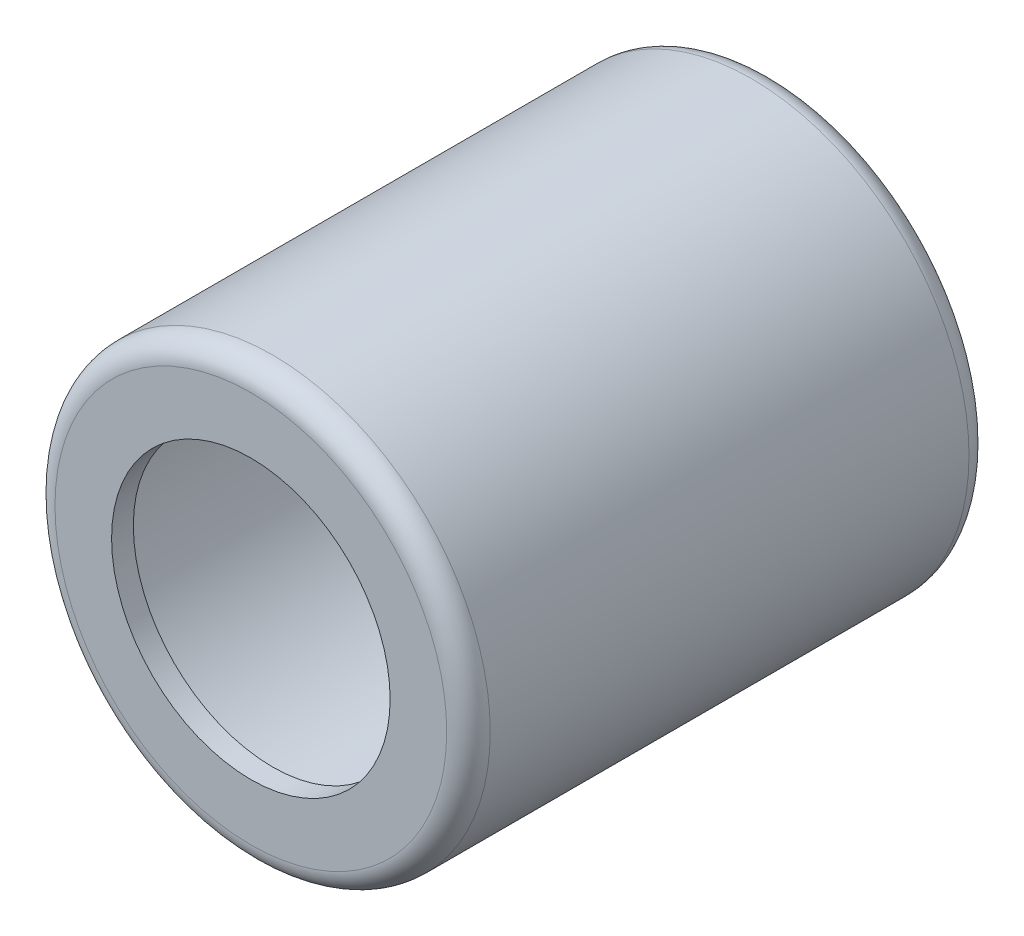
ISO-10303-21;
HEADER;
FILE_DESCRIPTION(('STEP AP214'),'2;1');
FILE_NAME('part.step','',(''),(''),'','','');
FILE_SCHEMA(('AUTOMOTIVE_DESIGN { 1 0 10303 214 1 1 1 1 }'));
ENDSEC;
DATA;
#1=APPLICATION_CONTEXT('core data for automotive mechanical design processes');
#2=APPLICATION_PROTOCOL_DEFINITION('international standard','automotive_design',2000,#1);
#3=PRODUCT_CONTEXT('',#1,'mechanical');
#4=PRODUCT('Part','Part','',(#3));
#5=PRODUCT_RELATED_PRODUCT_CATEGORY('part','',(#4));
#6=PRODUCT_DEFINITION_FORMATION('','',#4);
#7=PRODUCT_DEFINITION_CONTEXT('part definition',#1,'design');
#8=PRODUCT_DEFINITION('design','',#6,#7);
#9=PRODUCT_DEFINITION_SHAPE('','',#8);
#10=(LENGTH_UNIT() NAMED_UNIT(*) SI_UNIT(.MILLI.,.METRE.));
#11=(NAMED_UNIT(*) PLANE_ANGLE_UNIT() SI_UNIT($,.RADIAN.));
#12=(NAMED_UNIT(*) SI_UNIT($,.STERADIAN.) SOLID_ANGLE_UNIT());
#13=UNCERTAINTY_MEASURE_WITH_UNIT(LENGTH_MEASURE(1.E-05),#10,'distance_accuracy_value','');
#14=(GEOMETRIC_REPRESENTATION_CONTEXT(3) GLOBAL_UNCERTAINTY_ASSIGNED_CONTEXT((#13)) GLOBAL_UNIT_ASSIGNED_CONTEXT((#10,
#11,#12)) REPRESENTATION_CONTEXT('',''));
#15=CARTESIAN_POINT('',(0.,0.,0.));
#16=DIRECTION('',(0.,0.,1.));
#17=DIRECTION('',(1.,0.,0.));
#18=AXIS2_PLACEMENT_3D('',#15,#16,#17);
#19=CARTESIAN_POINT('',(0.,0.,32.4033102182323));
#20=DIRECTION('',(0.,0.,1.));
#21=DIRECTION('',(1.,0.,0.));
#22=AXIS2_PLACEMENT_3D('',#19,#20,#21);
#23=CYLINDRICAL_SURFACE('',#22,3.2);
#24=CARTESIAN_POINT('',(0.,0.,6.));
#25=DIRECTION('',(0.,0.,1.));
#26=DIRECTION('',(1.,0.,0.));
#27=AXIS2_PLACEMENT_3D('',#24,#25,#26);
#28=CIRCLE('',#27,3.2);
#29=CARTESIAN_POINT('',(3.2,0.,6.));
#30=VERTEX_POINT('',#29);
#31=EDGE_CURVE('E65',#30,#30,#28,.T.);
#32=ORIENTED_EDGE('',*,*,#31,.T.);
#33=EDGE_LOOP('',(#32));
#34=FACE_BOUND('',#33,.T.);
#35=CARTESIAN_POINT('',(0.,0.,5.5));
#36=DIRECTION('',(0.,0.,1.));
#37=DIRECTION('',(1.,0.,0.));
#38=AXIS2_PLACEMENT_3D('',#35,#36,#37);
#39=CIRCLE('',#38,3.2);
#40=CARTESIAN_POINT('',(3.2,0.,5.5));
#41=VERTEX_POINT('',#40);
#42=EDGE_CURVE('E74',#41,#41,#39,.T.);
#43=ORIENTED_EDGE('',*,*,#42,.F.);
#44=EDGE_LOOP('',(#43));
#45=FACE_BOUND('',#44,.T.);
#46=ADVANCED_FACE('F33',(#34,#45),#23,.F.);
#47=CARTESIAN_POINT('',(3.2,0.,6.));
#48=DIRECTION('',(0.,0.,1.));
#49=DIRECTION('',(1.,0.,0.));
#50=AXIS2_PLACEMENT_3D('',#47,#48,#49);
#51=PLANE('',#50);
#52=CARTESIAN_POINT('',(0.,0.,6.));
#53=DIRECTION('',(0.,0.,1.));
#54=DIRECTION('',(1.,0.,0.));
#55=AXIS2_PLACEMENT_3D('',#52,#53,#54);
#56=CIRCLE('',#55,4.5);
#57=CARTESIAN_POINT('',(4.5,0.,6.));
#58=VERTEX_POINT('',#57);
#59=EDGE_CURVE('E48',#58,#58,#56,.T.);
#60=ORIENTED_EDGE('',*,*,#59,.T.);
#61=EDGE_LOOP('',(#60));
#62=FACE_BOUND('',#61,.T.);
#63=ORIENTED_EDGE('',*,*,#31,.F.);
#64=EDGE_LOOP('',(#63));
#65=FACE_BOUND('',#64,.T.);
#66=ADVANCED_FACE('F81',(#62,#65),#51,.T.);
#67=CARTESIAN_POINT('',(0.,0.,32.4033102182323));
#68=DIRECTION('',(0.,0.,1.));
#69=DIRECTION('',(1.,0.,0.));
#70=AXIS2_PLACEMENT_3D('',#67,#68,#69);
#71=CYLINDRICAL_SURFACE('',#70,5.);
#72=CARTESIAN_POINT('',(0.,0.,-5.5));
#73=DIRECTION('',(0.,0.,-1.));
#74=DIRECTION('',(-1.,0.,0.));
#75=AXIS2_PLACEMENT_3D('',#72,#73,#74);
#76=CIRCLE('',#75,5.);
#77=CARTESIAN_POINT('',(-5.,0.,-5.5));
#78=VERTEX_POINT('',#77);
#79=EDGE_CURVE('E40',#78,#78,#76,.F.);
#80=ORIENTED_EDGE('',*,*,#79,.T.);
#81=EDGE_LOOP('',(#80));
#82=FACE_BOUND('',#81,.T.);
#83=CARTESIAN_POINT('',(0.,0.,5.5));
#84=DIRECTION('',(0.,0.,1.));
#85=DIRECTION('',(1.,0.,0.));
#86=AXIS2_PLACEMENT_3D('',#83,#84,#85);
#87=CIRCLE('',#86,5.);
#88=CARTESIAN_POINT('',(5.,0.,5.5));
#89=VERTEX_POINT('',#88);
#90=EDGE_CURVE('E44',#89,#89,#87,.F.);
#91=ORIENTED_EDGE('',*,*,#90,.T.);
#92=EDGE_LOOP('',(#91));
#93=FACE_BOUND('',#92,.T.);
#94=ADVANCED_FACE('F87',(#82,#93),#71,.T.);
#95=CARTESIAN_POINT('',(5.,0.,-6.));
#96=DIRECTION('',(0.,0.,-1.));
#97=DIRECTION('',(-1.,0.,0.));
#98=AXIS2_PLACEMENT_3D('',#95,#96,#97);
#99=PLANE('',#98);
#100=CARTESIAN_POINT('',(0.,0.,-6.));
#101=DIRECTION('',(0.,0.,-1.));
#102=DIRECTION('',(-1.,0.,0.));
#103=AXIS2_PLACEMENT_3D('',#100,#101,#102);
#104=CIRCLE('',#103,4.5);
#105=CARTESIAN_POINT('',(-4.5,0.,-6.));
#106=VERTEX_POINT('',#105);
#107=EDGE_CURVE('E10',#106,#106,#104,.T.);
#108=ORIENTED_EDGE('',*,*,#107,.T.);
#109=EDGE_LOOP('',(#108));
#110=FACE_BOUND('',#109,.T.);
#111=CARTESIAN_POINT('',(0.,0.,-6.));
#112=DIRECTION('',(0.,0.,1.));
#113=DIRECTION('',(1.,0.,0.));
#114=AXIS2_PLACEMENT_3D('',#111,#112,#113);
#115=CIRCLE('',#114,3.2);
#116=CARTESIAN_POINT('',(3.2,0.,-6.));
#117=VERTEX_POINT('',#116);
#118=EDGE_CURVE('E68',#117,#117,#115,.T.);
#119=ORIENTED_EDGE('',*,*,#118,.T.);
#120=EDGE_LOOP('',(#119));
#121=FACE_BOUND('',#120,.T.);
#122=ADVANCED_FACE('F113',(#110,#121),#99,.T.);
#123=CARTESIAN_POINT('',(0.,0.,32.4033102182323));
#124=DIRECTION('',(0.,0.,1.));
#125=DIRECTION('',(1.,0.,0.));
#126=AXIS2_PLACEMENT_3D('',#123,#124,#125);
#127=CYLINDRICAL_SURFACE('',#126,3.2);
#128=CARTESIAN_POINT('',(0.,0.,-5.5));
#129=DIRECTION('',(0.,0.,1.));
#130=DIRECTION('',(1.,0.,0.));
#131=AXIS2_PLACEMENT_3D('',#128,#129,#130);
#132=CIRCLE('',#131,3.2);
#133=CARTESIAN_POINT('',(3.2,0.,-5.5));
#134=VERTEX_POINT('',#133);
#135=EDGE_CURVE('E71',#134,#134,#132,.T.);
#136=ORIENTED_EDGE('',*,*,#135,.T.);
#137=EDGE_LOOP('',(#136));
#138=FACE_BOUND('',#137,.T.);
#139=ORIENTED_EDGE('',*,*,#118,.F.);
#140=EDGE_LOOP('',(#139));
#141=FACE_BOUND('',#140,.T.);
#142=ADVANCED_FACE('F117',(#138,#141),#127,.F.);
#143=CARTESIAN_POINT('',(4.5,0.,-5.5));
#144=DIRECTION('',(0.,0.,1.));
#145=DIRECTION('',(1.,0.,0.));
#146=AXIS2_PLACEMENT_3D('',#143,#144,#145);
#147=PLANE('',#146);
#148=CARTESIAN_POINT('',(0.,0.,-5.5));
#149=DIRECTION('',(0.,0.,1.));
#150=DIRECTION('',(1.,0.,0.));
#151=AXIS2_PLACEMENT_3D('',#148,#149,#150);
#152=CIRCLE('',#151,4.2);
#153=CARTESIAN_POINT('',(4.2,0.,-5.5));
#154=VERTEX_POINT('',#153);
#155=EDGE_CURVE('E62',#154,#154,#152,.T.);
#156=ORIENTED_EDGE('',*,*,#155,.T.);
#157=EDGE_LOOP('',(#156));
#158=FACE_BOUND('',#157,.T.);
#159=ORIENTED_EDGE('',*,*,#135,.F.);
#160=EDGE_LOOP('',(#159));
#161=FACE_BOUND('',#160,.T.);
#162=ADVANCED_FACE('F122',(#158,#161),#147,.T.);
#163=CARTESIAN_POINT('',(0.,0.,32.4033102182323));
#164=DIRECTION('',(0.,0.,1.));
#165=DIRECTION('',(1.,0.,0.));
#166=AXIS2_PLACEMENT_3D('',#163,#164,#165);
#167=CYLINDRICAL_SURFACE('',#166,4.5);
#168=CARTESIAN_POINT('',(0.,0.,-5.2));
#169=DIRECTION('',(0.,0.,1.));
#170=DIRECTION('',(1.,0.,0.));
#171=AXIS2_PLACEMENT_3D('',#168,#169,#170);
#172=CIRCLE('',#171,4.5);
#173=CARTESIAN_POINT('',(4.5,0.,-5.2));
#174=VERTEX_POINT('',#173);
#175=EDGE_CURVE('E56',#174,#174,#172,.F.);
#176=ORIENTED_EDGE('',*,*,#175,.T.);
#177=EDGE_LOOP('',(#176));
#178=FACE_BOUND('',#177,.T.);
#179=CARTESIAN_POINT('',(0.,0.,5.2));
#180=DIRECTION('',(0.,0.,-1.));
#181=DIRECTION('',(-1.,0.,0.));
#182=AXIS2_PLACEMENT_3D('',#179,#180,#181);
#183=CIRCLE('',#182,4.5);
#184=CARTESIAN_POINT('',(-4.5,0.,5.2));
#185=VERTEX_POINT('',#184);
#186=EDGE_CURVE('E59',#185,#185,#183,.F.);
#187=ORIENTED_EDGE('',*,*,#186,.T.);
#188=EDGE_LOOP('',(#187));
#189=FACE_BOUND('',#188,.T.);
#190=ADVANCED_FACE('F126',(#178,#189),#167,.F.);
#191=CARTESIAN_POINT('',(3.2,0.,5.5));
#192=DIRECTION('',(0.,0.,-1.));
#193=DIRECTION('',(-1.,0.,0.));
#194=AXIS2_PLACEMENT_3D('',#191,#192,#193);
#195=PLANE('',#194);
#196=CARTESIAN_POINT('',(0.,0.,5.5));
#197=DIRECTION('',(0.,0.,-1.));
#198=DIRECTION('',(-1.,0.,0.));
#199=AXIS2_PLACEMENT_3D('',#196,#197,#198);
#200=CIRCLE('',#199,4.2);
#201=CARTESIAN_POINT('',(-4.2,0.,5.5));
#202=VERTEX_POINT('',#201);
#203=EDGE_CURVE('E53',#202,#202,#200,.T.);
#204=ORIENTED_EDGE('',*,*,#203,.T.);
#205=EDGE_LOOP('',(#204));
#206=FACE_BOUND('',#205,.T.);
#207=ORIENTED_EDGE('',*,*,#42,.T.);
#208=EDGE_LOOP('',(#207));
#209=FACE_BOUND('',#208,.T.);
#210=ADVANCED_FACE('F78',(#206,#209),#195,.T.);
#211=CARTESIAN_POINT('',(0.,0.,-5.2));
#212=DIRECTION('',(0.,0.,1.));
#213=DIRECTION('',(1.,0.,0.));
#214=AXIS2_PLACEMENT_3D('',#211,#212,#213);
#215=TOROIDAL_SURFACE('',#214,4.2,0.3);
#216=ORIENTED_EDGE('',*,*,#175,.F.);
#217=EDGE_LOOP('',(#216));
#218=FACE_BOUND('',#217,.T.);
#219=ORIENTED_EDGE('',*,*,#155,.F.);
#220=EDGE_LOOP('',(#219));
#221=FACE_BOUND('',#220,.T.);
#222=ADVANCED_FACE('F92',(#218,#221),#215,.F.);
#223=CARTESIAN_POINT('',(0.,0.,5.2));
#224=DIRECTION('',(0.,0.,-1.));
#225=DIRECTION('',(-1.,0.,0.));
#226=AXIS2_PLACEMENT_3D('',#223,#224,#225);
#227=TOROIDAL_SURFACE('',#226,4.2,0.3);
#228=ORIENTED_EDGE('',*,*,#203,.F.);
#229=EDGE_LOOP('',(#228));
#230=FACE_BOUND('',#229,.T.);
#231=ORIENTED_EDGE('',*,*,#186,.F.);
#232=EDGE_LOOP('',(#231));
#233=FACE_BOUND('',#232,.T.);
#234=ADVANCED_FACE('F95',(#230,#233),#227,.F.);
#235=CARTESIAN_POINT('',(0.,0.,5.5));
#236=DIRECTION('',(0.,0.,1.));
#237=DIRECTION('',(1.,0.,0.));
#238=AXIS2_PLACEMENT_3D('',#235,#236,#237);
#239=TOROIDAL_SURFACE('',#238,4.5,0.5);
#240=ORIENTED_EDGE('',*,*,#90,.F.);
#241=EDGE_LOOP('',(#240));
#242=FACE_BOUND('',#241,.T.);
#243=ORIENTED_EDGE('',*,*,#59,.F.);
#244=EDGE_LOOP('',(#243));
#245=FACE_BOUND('',#244,.T.);
#246=ADVANCED_FACE('F98',(#242,#245),#239,.T.);
#247=CARTESIAN_POINT('',(0.,0.,-5.5));
#248=DIRECTION('',(0.,0.,-1.));
#249=DIRECTION('',(-1.,0.,0.));
#250=AXIS2_PLACEMENT_3D('',#247,#248,#249);
#251=TOROIDAL_SURFACE('',#250,4.5,0.5);
#252=ORIENTED_EDGE('',*,*,#107,.F.);
#253=EDGE_LOOP('',(#252));
#254=FACE_BOUND('',#253,.T.);
#255=ORIENTED_EDGE('',*,*,#79,.F.);
#256=EDGE_LOOP('',(#255));
#257=FACE_BOUND('',#256,.T.);
#258=ADVANCED_FACE('F35',(#254,#257),#251,.T.);
#259=CLOSED_SHELL('',(#46,#66,#94,#122,#142,#162,#190,#210,#222,#234,#246,#258));
#260=MANIFOLD_SOLID_BREP('B2',#259);
#261=ADVANCED_BREP_SHAPE_REPRESENTATION('',(#18,#260),#14);
#262=SHAPE_DEFINITION_REPRESENTATION(#9,#261);
ENDSEC;
END-ISO-10303-21;
